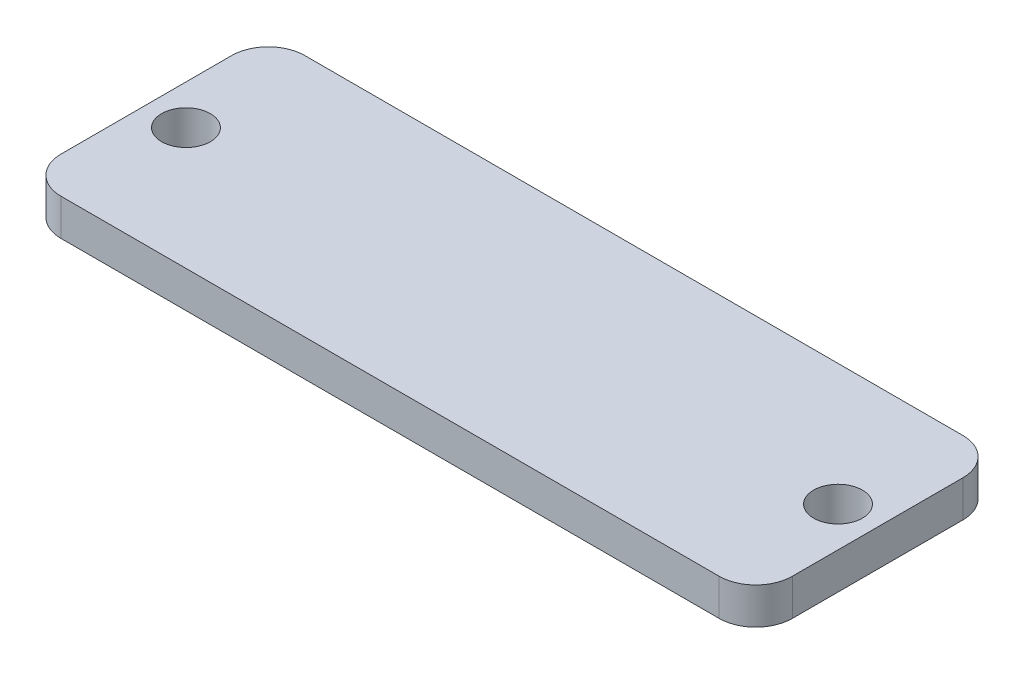
ISO-10303-21;
HEADER;
FILE_DESCRIPTION(('STEP AP214'),'2;1');
FILE_NAME('part.step','',(''),(''),'','','');
FILE_SCHEMA(('AUTOMOTIVE_DESIGN { 1 0 10303 214 1 1 1 1 }'));
ENDSEC;
DATA;
#1=APPLICATION_CONTEXT('core data for automotive mechanical design processes');
#2=APPLICATION_PROTOCOL_DEFINITION('international standard','automotive_design',2000,#1);
#3=PRODUCT_CONTEXT('',#1,'mechanical');
#4=PRODUCT('Part','Part','',(#3));
#5=PRODUCT_RELATED_PRODUCT_CATEGORY('part','',(#4));
#6=PRODUCT_DEFINITION_FORMATION('','',#4);
#7=PRODUCT_DEFINITION_CONTEXT('part definition',#1,'design');
#8=PRODUCT_DEFINITION('design','',#6,#7);
#9=PRODUCT_DEFINITION_SHAPE('','',#8);
#10=(LENGTH_UNIT() NAMED_UNIT(*) SI_UNIT(.MILLI.,.METRE.));
#11=(NAMED_UNIT(*) PLANE_ANGLE_UNIT() SI_UNIT($,.RADIAN.));
#12=(NAMED_UNIT(*) SI_UNIT($,.STERADIAN.) SOLID_ANGLE_UNIT());
#13=UNCERTAINTY_MEASURE_WITH_UNIT(LENGTH_MEASURE(1.E-05),#10,'distance_accuracy_value','');
#14=(GEOMETRIC_REPRESENTATION_CONTEXT(3) GLOBAL_UNCERTAINTY_ASSIGNED_CONTEXT((#13)) GLOBAL_UNIT_ASSIGNED_CONTEXT((#10,
#11,#12)) REPRESENTATION_CONTEXT('',''));
#15=CARTESIAN_POINT('',(0.,0.,0.));
#16=DIRECTION('',(0.,0.,1.));
#17=DIRECTION('',(1.,0.,0.));
#18=AXIS2_PLACEMENT_3D('',#15,#16,#17);
#19=CARTESIAN_POINT('',(30.,3.,10.));
#20=DIRECTION('',(-1.,0.,0.));
#21=DIRECTION('',(0.,0.,1.));
#22=AXIS2_PLACEMENT_3D('',#19,#20,#21);
#23=PLANE('',#22);
#24=DIRECTION('',(0.,0.,-1.));
#25=VECTOR('',#24,1.);
#26=CARTESIAN_POINT('',(30.,0.,10.));
#27=LINE('',#26,#25);
#28=CARTESIAN_POINT('',(30.,0.,7.));
#29=VERTEX_POINT('',#28);
#30=CARTESIAN_POINT('',(30.,0.,-7.));
#31=VERTEX_POINT('',#30);
#32=EDGE_CURVE('E130',#29,#31,#27,.T.);
#33=ORIENTED_EDGE('',*,*,#32,.T.);
#34=DIRECTION('',(0.,-1.,0.));
#35=VECTOR('',#34,1.);
#36=CARTESIAN_POINT('',(30.,3.,-7.));
#37=LINE('',#36,#35);
#38=CARTESIAN_POINT('',(30.,3.,-7.));
#39=VERTEX_POINT('',#38);
#40=EDGE_CURVE('E153',#31,#39,#37,.F.);
#41=ORIENTED_EDGE('',*,*,#40,.T.);
#42=DIRECTION('',(0.,0.,-1.));
#43=VECTOR('',#42,1.);
#44=CARTESIAN_POINT('',(30.,3.,10.));
#45=LINE('',#44,#43);
#46=CARTESIAN_POINT('',(30.,3.,7.));
#47=VERTEX_POINT('',#46);
#48=EDGE_CURVE('E128',#47,#39,#45,.T.);
#49=ORIENTED_EDGE('',*,*,#48,.F.);
#50=DIRECTION('',(0.,-1.,0.));
#51=VECTOR('',#50,1.);
#52=CARTESIAN_POINT('',(30.,3.,7.));
#53=LINE('',#52,#51);
#54=EDGE_CURVE('E150',#47,#29,#53,.T.);
#55=ORIENTED_EDGE('',*,*,#54,.T.);
#56=EDGE_LOOP('',(#33,#41,#49,#55));
#57=FACE_BOUND('',#56,.T.);
#58=ADVANCED_FACE('F35',(#57),#23,.F.);
#59=CARTESIAN_POINT('',(-30.,3.,-10.));
#60=DIRECTION('',(0.,0.,1.));
#61=DIRECTION('',(1.,0.,0.));
#62=AXIS2_PLACEMENT_3D('',#59,#60,#61);
#63=PLANE('',#62);
#64=DIRECTION('',(-1.,0.,0.));
#65=VECTOR('',#64,1.);
#66=CARTESIAN_POINT('',(-30.,0.,-10.));
#67=LINE('',#66,#65);
#68=CARTESIAN_POINT('',(27.,0.,-10.));
#69=VERTEX_POINT('',#68);
#70=CARTESIAN_POINT('',(-27.,0.,-10.));
#71=VERTEX_POINT('',#70);
#72=EDGE_CURVE('E126',#69,#71,#67,.T.);
#73=ORIENTED_EDGE('',*,*,#72,.T.);
#74=DIRECTION('',(0.,-1.,0.));
#75=VECTOR('',#74,1.);
#76=CARTESIAN_POINT('',(-27.,3.,-10.));
#77=LINE('',#76,#75);
#78=CARTESIAN_POINT('',(-27.,3.,-10.));
#79=VERTEX_POINT('',#78);
#80=EDGE_CURVE('E105',#71,#79,#77,.F.);
#81=ORIENTED_EDGE('',*,*,#80,.T.);
#82=DIRECTION('',(-1.,0.,0.));
#83=VECTOR('',#82,1.);
#84=CARTESIAN_POINT('',(-30.,3.,-10.));
#85=LINE('',#84,#83);
#86=CARTESIAN_POINT('',(27.,3.,-10.));
#87=VERTEX_POINT('',#86);
#88=EDGE_CURVE('E169',#87,#79,#85,.T.);
#89=ORIENTED_EDGE('',*,*,#88,.F.);
#90=DIRECTION('',(0.,-1.,0.));
#91=VECTOR('',#90,1.);
#92=CARTESIAN_POINT('',(27.,3.,-10.));
#93=LINE('',#92,#91);
#94=EDGE_CURVE('E110',#87,#69,#93,.T.);
#95=ORIENTED_EDGE('',*,*,#94,.T.);
#96=EDGE_LOOP('',(#73,#81,#89,#95));
#97=FACE_BOUND('',#96,.T.);
#98=ADVANCED_FACE('F202',(#97),#63,.F.);
#99=CARTESIAN_POINT('',(-30.,3.,10.));
#100=DIRECTION('',(1.,0.,0.));
#101=DIRECTION('',(0.,0.,-1.));
#102=AXIS2_PLACEMENT_3D('',#99,#100,#101);
#103=PLANE('',#102);
#104=DIRECTION('',(0.,0.,1.));
#105=VECTOR('',#104,1.);
#106=CARTESIAN_POINT('',(-30.,3.,10.));
#107=LINE('',#106,#105);
#108=CARTESIAN_POINT('',(-30.,3.,-7.));
#109=VERTEX_POINT('',#108);
#110=CARTESIAN_POINT('',(-30.,3.,7.));
#111=VERTEX_POINT('',#110);
#112=EDGE_CURVE('E119',#109,#111,#107,.T.);
#113=ORIENTED_EDGE('',*,*,#112,.F.);
#114=DIRECTION('',(0.,-1.,0.));
#115=VECTOR('',#114,1.);
#116=CARTESIAN_POINT('',(-30.,3.,-7.));
#117=LINE('',#116,#115);
#118=CARTESIAN_POINT('',(-30.,0.,-7.));
#119=VERTEX_POINT('',#118);
#120=EDGE_CURVE('E104',#109,#119,#117,.T.);
#121=ORIENTED_EDGE('',*,*,#120,.T.);
#122=DIRECTION('',(0.,0.,1.));
#123=VECTOR('',#122,1.);
#124=CARTESIAN_POINT('',(-30.,0.,10.));
#125=LINE('',#124,#123);
#126=CARTESIAN_POINT('',(-30.,0.,7.));
#127=VERTEX_POINT('',#126);
#128=EDGE_CURVE('E117',#119,#127,#125,.T.);
#129=ORIENTED_EDGE('',*,*,#128,.T.);
#130=DIRECTION('',(0.,-1.,0.));
#131=VECTOR('',#130,1.);
#132=CARTESIAN_POINT('',(-30.,3.,7.));
#133=LINE('',#132,#131);
#134=EDGE_CURVE('E121',#127,#111,#133,.F.);
#135=ORIENTED_EDGE('',*,*,#134,.T.);
#136=EDGE_LOOP('',(#113,#121,#129,#135));
#137=FACE_BOUND('',#136,.T.);
#138=ADVANCED_FACE('F116',(#137),#103,.F.);
#139=CARTESIAN_POINT('',(-30.,3.,10.));
#140=DIRECTION('',(0.,0.,-1.));
#141=DIRECTION('',(-1.,0.,0.));
#142=AXIS2_PLACEMENT_3D('',#139,#140,#141);
#143=PLANE('',#142);
#144=DIRECTION('',(1.,0.,0.));
#145=VECTOR('',#144,1.);
#146=CARTESIAN_POINT('',(-30.,0.,10.));
#147=LINE('',#146,#145);
#148=CARTESIAN_POINT('',(-27.,0.,10.));
#149=VERTEX_POINT('',#148);
#150=CARTESIAN_POINT('',(27.,0.,10.));
#151=VERTEX_POINT('',#150);
#152=EDGE_CURVE('E125',#149,#151,#147,.T.);
#153=ORIENTED_EDGE('',*,*,#152,.T.);
#154=DIRECTION('',(0.,-1.,0.));
#155=VECTOR('',#154,1.);
#156=CARTESIAN_POINT('',(27.,3.,10.));
#157=LINE('',#156,#155);
#158=CARTESIAN_POINT('',(27.,3.,10.));
#159=VERTEX_POINT('',#158);
#160=EDGE_CURVE('E11',#151,#159,#157,.F.);
#161=ORIENTED_EDGE('',*,*,#160,.T.);
#162=DIRECTION('',(1.,0.,0.));
#163=VECTOR('',#162,1.);
#164=CARTESIAN_POINT('',(-30.,3.,10.));
#165=LINE('',#164,#163);
#166=CARTESIAN_POINT('',(-27.,3.,10.));
#167=VERTEX_POINT('',#166);
#168=EDGE_CURVE('E134',#167,#159,#165,.T.);
#169=ORIENTED_EDGE('',*,*,#168,.F.);
#170=DIRECTION('',(0.,-1.,0.));
#171=VECTOR('',#170,1.);
#172=CARTESIAN_POINT('',(-27.,3.,10.));
#173=LINE('',#172,#171);
#174=EDGE_CURVE('E43',#167,#149,#173,.T.);
#175=ORIENTED_EDGE('',*,*,#174,.T.);
#176=EDGE_LOOP('',(#153,#161,#169,#175));
#177=FACE_BOUND('',#176,.T.);
#178=ADVANCED_FACE('F156',(#177),#143,.F.);
#179=CARTESIAN_POINT('',(0.,3.,0.));
#180=DIRECTION('',(0.,-1.,0.));
#181=DIRECTION('',(0.,0.,-1.));
#182=AXIS2_PLACEMENT_3D('',#179,#180,#181);
#183=PLANE('',#182);
#184=CARTESIAN_POINT('',(26.75,3.,0.));
#185=DIRECTION('',(0.,1.,0.));
#186=DIRECTION('',(0.,0.,1.));
#187=AXIS2_PLACEMENT_3D('',#184,#185,#186);
#188=CIRCLE('',#187,2.);
#189=CARTESIAN_POINT('',(26.75,3.,2.));
#190=VERTEX_POINT('',#189);
#191=EDGE_CURVE('E180',#190,#190,#188,.T.);
#192=ORIENTED_EDGE('',*,*,#191,.F.);
#193=EDGE_LOOP('',(#192));
#194=FACE_BOUND('',#193,.T.);
#195=CARTESIAN_POINT('',(-26.75,3.,0.));
#196=DIRECTION('',(0.,1.,0.));
#197=DIRECTION('',(0.,0.,-1.));
#198=AXIS2_PLACEMENT_3D('',#195,#196,#197);
#199=CIRCLE('',#198,2.);
#200=CARTESIAN_POINT('',(-26.75,3.,-2.));
#201=VERTEX_POINT('',#200);
#202=EDGE_CURVE('E174',#201,#201,#199,.T.);
#203=ORIENTED_EDGE('',*,*,#202,.F.);
#204=EDGE_LOOP('',(#203));
#205=FACE_BOUND('',#204,.T.);
#206=ORIENTED_EDGE('',*,*,#88,.T.);
#207=CARTESIAN_POINT('',(-27.,3.,-7.));
#208=DIRECTION('',(0.,-1.,0.));
#209=DIRECTION('',(0.,0.,-1.));
#210=AXIS2_PLACEMENT_3D('',#207,#208,#209);
#211=CIRCLE('',#210,3.);
#212=EDGE_CURVE('E148',#79,#109,#211,.F.);
#213=ORIENTED_EDGE('',*,*,#212,.T.);
#214=ORIENTED_EDGE('',*,*,#112,.T.);
#215=CARTESIAN_POINT('',(-27.,3.,7.));
#216=DIRECTION('',(0.,-1.,0.));
#217=DIRECTION('',(0.,0.,-1.));
#218=AXIS2_PLACEMENT_3D('',#215,#216,#217);
#219=CIRCLE('',#218,3.);
#220=EDGE_CURVE('E55',#111,#167,#219,.F.);
#221=ORIENTED_EDGE('',*,*,#220,.T.);
#222=ORIENTED_EDGE('',*,*,#168,.T.);
#223=CARTESIAN_POINT('',(27.,3.,7.));
#224=DIRECTION('',(0.,-1.,0.));
#225=DIRECTION('',(0.,0.,-1.));
#226=AXIS2_PLACEMENT_3D('',#223,#224,#225);
#227=CIRCLE('',#226,3.);
#228=EDGE_CURVE('E144',#159,#47,#227,.F.);
#229=ORIENTED_EDGE('',*,*,#228,.T.);
#230=ORIENTED_EDGE('',*,*,#48,.T.);
#231=CARTESIAN_POINT('',(27.,3.,-7.));
#232=DIRECTION('',(0.,-1.,0.));
#233=DIRECTION('',(0.,0.,-1.));
#234=AXIS2_PLACEMENT_3D('',#231,#232,#233);
#235=CIRCLE('',#234,3.);
#236=EDGE_CURVE('E146',#39,#87,#235,.F.);
#237=ORIENTED_EDGE('',*,*,#236,.T.);
#238=EDGE_LOOP('',(#206,#213,#214,#221,#222,#229,#230,#237));
#239=FACE_BOUND('',#238,.T.);
#240=ADVANCED_FACE('F195',(#194,#205,#239),#183,.F.);
#241=CARTESIAN_POINT('',(0.,0.,0.));
#242=DIRECTION('',(0.,-1.,0.));
#243=DIRECTION('',(0.,0.,-1.));
#244=AXIS2_PLACEMENT_3D('',#241,#242,#243);
#245=PLANE('',#244);
#246=CARTESIAN_POINT('',(26.75,0.,0.));
#247=DIRECTION('',(0.,1.,0.));
#248=DIRECTION('',(0.,0.,1.));
#249=AXIS2_PLACEMENT_3D('',#246,#247,#248);
#250=CIRCLE('',#249,2.);
#251=CARTESIAN_POINT('',(26.75,0.,2.));
#252=VERTEX_POINT('',#251);
#253=EDGE_CURVE('E178',#252,#252,#250,.T.);
#254=ORIENTED_EDGE('',*,*,#253,.T.);
#255=EDGE_LOOP('',(#254));
#256=FACE_BOUND('',#255,.T.);
#257=CARTESIAN_POINT('',(-26.75,0.,0.));
#258=DIRECTION('',(0.,1.,0.));
#259=DIRECTION('',(0.,0.,-1.));
#260=AXIS2_PLACEMENT_3D('',#257,#258,#259);
#261=CIRCLE('',#260,2.);
#262=CARTESIAN_POINT('',(-26.75,0.,-2.));
#263=VERTEX_POINT('',#262);
#264=EDGE_CURVE('E185',#263,#263,#261,.T.);
#265=ORIENTED_EDGE('',*,*,#264,.T.);
#266=EDGE_LOOP('',(#265));
#267=FACE_BOUND('',#266,.T.);
#268=ORIENTED_EDGE('',*,*,#128,.F.);
#269=CARTESIAN_POINT('',(-27.,0.,-7.));
#270=DIRECTION('',(0.,-1.,0.));
#271=DIRECTION('',(0.,0.,-1.));
#272=AXIS2_PLACEMENT_3D('',#269,#270,#271);
#273=CIRCLE('',#272,3.);
#274=EDGE_CURVE('E100',#119,#71,#273,.T.);
#275=ORIENTED_EDGE('',*,*,#274,.T.);
#276=ORIENTED_EDGE('',*,*,#72,.F.);
#277=CARTESIAN_POINT('',(27.,0.,-7.));
#278=DIRECTION('',(0.,-1.,0.));
#279=DIRECTION('',(0.,0.,-1.));
#280=AXIS2_PLACEMENT_3D('',#277,#278,#279);
#281=CIRCLE('',#280,3.);
#282=EDGE_CURVE('E111',#69,#31,#281,.T.);
#283=ORIENTED_EDGE('',*,*,#282,.T.);
#284=ORIENTED_EDGE('',*,*,#32,.F.);
#285=CARTESIAN_POINT('',(27.,0.,7.));
#286=DIRECTION('',(0.,-1.,0.));
#287=DIRECTION('',(0.,0.,-1.));
#288=AXIS2_PLACEMENT_3D('',#285,#286,#287);
#289=CIRCLE('',#288,3.);
#290=EDGE_CURVE('E137',#29,#151,#289,.T.);
#291=ORIENTED_EDGE('',*,*,#290,.T.);
#292=ORIENTED_EDGE('',*,*,#152,.F.);
#293=CARTESIAN_POINT('',(-27.,0.,7.));
#294=DIRECTION('',(0.,-1.,0.));
#295=DIRECTION('',(0.,0.,-1.));
#296=AXIS2_PLACEMENT_3D('',#293,#294,#295);
#297=CIRCLE('',#296,3.);
#298=EDGE_CURVE('E120',#149,#127,#297,.T.);
#299=ORIENTED_EDGE('',*,*,#298,.T.);
#300=EDGE_LOOP('',(#268,#275,#276,#283,#284,#291,#292,#299));
#301=FACE_BOUND('',#300,.T.);
#302=ADVANCED_FACE('F123',(#256,#267,#301),#245,.T.);
#303=CARTESIAN_POINT('',(-27.,3.,-7.));
#304=DIRECTION('',(0.,-1.,0.));
#305=DIRECTION('',(0.,0.,-1.));
#306=AXIS2_PLACEMENT_3D('',#303,#304,#305);
#307=CYLINDRICAL_SURFACE('',#306,3.);
#308=ORIENTED_EDGE('',*,*,#212,.F.);
#309=ORIENTED_EDGE('',*,*,#80,.F.);
#310=ORIENTED_EDGE('',*,*,#274,.F.);
#311=ORIENTED_EDGE('',*,*,#120,.F.);
#312=EDGE_LOOP('',(#308,#309,#310,#311));
#313=FACE_BOUND('',#312,.T.);
#314=ADVANCED_FACE('F103',(#313),#307,.T.);
#315=CARTESIAN_POINT('',(27.,3.,-7.));
#316=DIRECTION('',(0.,-1.,0.));
#317=DIRECTION('',(0.,0.,-1.));
#318=AXIS2_PLACEMENT_3D('',#315,#316,#317);
#319=CYLINDRICAL_SURFACE('',#318,3.);
#320=ORIENTED_EDGE('',*,*,#236,.F.);
#321=ORIENTED_EDGE('',*,*,#40,.F.);
#322=ORIENTED_EDGE('',*,*,#282,.F.);
#323=ORIENTED_EDGE('',*,*,#94,.F.);
#324=EDGE_LOOP('',(#320,#321,#322,#323));
#325=FACE_BOUND('',#324,.T.);
#326=ADVANCED_FACE('F204',(#325),#319,.T.);
#327=CARTESIAN_POINT('',(27.,3.,7.));
#328=DIRECTION('',(0.,-1.,0.));
#329=DIRECTION('',(0.,0.,-1.));
#330=AXIS2_PLACEMENT_3D('',#327,#328,#329);
#331=CYLINDRICAL_SURFACE('',#330,3.);
#332=ORIENTED_EDGE('',*,*,#228,.F.);
#333=ORIENTED_EDGE('',*,*,#160,.F.);
#334=ORIENTED_EDGE('',*,*,#290,.F.);
#335=ORIENTED_EDGE('',*,*,#54,.F.);
#336=EDGE_LOOP('',(#332,#333,#334,#335));
#337=FACE_BOUND('',#336,.T.);
#338=ADVANCED_FACE('F163',(#337),#331,.T.);
#339=CARTESIAN_POINT('',(-27.,3.,7.));
#340=DIRECTION('',(0.,-1.,0.));
#341=DIRECTION('',(0.,0.,-1.));
#342=AXIS2_PLACEMENT_3D('',#339,#340,#341);
#343=CYLINDRICAL_SURFACE('',#342,3.);
#344=ORIENTED_EDGE('',*,*,#220,.F.);
#345=ORIENTED_EDGE('',*,*,#134,.F.);
#346=ORIENTED_EDGE('',*,*,#298,.F.);
#347=ORIENTED_EDGE('',*,*,#174,.F.);
#348=EDGE_LOOP('',(#344,#345,#346,#347));
#349=FACE_BOUND('',#348,.T.);
#350=ADVANCED_FACE('F37',(#349),#343,.T.);
#351=CARTESIAN_POINT('',(-26.75,0.,0.));
#352=DIRECTION('',(0.,1.,0.));
#353=DIRECTION('',(0.,0.,1.));
#354=AXIS2_PLACEMENT_3D('',#351,#352,#353);
#355=CYLINDRICAL_SURFACE('',#354,2.);
#356=ORIENTED_EDGE('',*,*,#264,.F.);
#357=EDGE_LOOP('',(#356));
#358=FACE_BOUND('',#357,.T.);
#359=ORIENTED_EDGE('',*,*,#202,.T.);
#360=EDGE_LOOP('',(#359));
#361=FACE_BOUND('',#360,.T.);
#362=ADVANCED_FACE('F193',(#358,#361),#355,.F.);
#363=CARTESIAN_POINT('',(26.75,0.,0.));
#364=DIRECTION('',(0.,1.,0.));
#365=DIRECTION('',(0.,0.,1.));
#366=AXIS2_PLACEMENT_3D('',#363,#364,#365);
#367=CYLINDRICAL_SURFACE('',#366,2.);
#368=ORIENTED_EDGE('',*,*,#253,.F.);
#369=EDGE_LOOP('',(#368));
#370=FACE_BOUND('',#369,.T.);
#371=ORIENTED_EDGE('',*,*,#191,.T.);
#372=EDGE_LOOP('',(#371));
#373=FACE_BOUND('',#372,.T.);
#374=ADVANCED_FACE('F227',(#370,#373),#367,.F.);
#375=CLOSED_SHELL('',(#58,#98,#138,#178,#240,#302,#314,#326,#338,#350,#362,#374));
#376=MANIFOLD_SOLID_BREP('B2',#375);
#377=ADVANCED_BREP_SHAPE_REPRESENTATION('',(#18,#376),#14);
#378=SHAPE_DEFINITION_REPRESENTATION(#9,#377);
ENDSEC;
END-ISO-10303-21;
